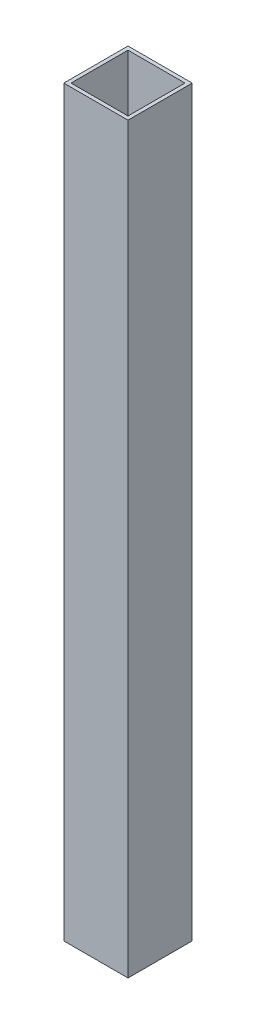
ISO-10303-21;
HEADER;
FILE_DESCRIPTION(('STEP AP214'),'2;1');
FILE_NAME('part.step','',(''),(''),'','','');
FILE_SCHEMA(('AUTOMOTIVE_DESIGN { 1 0 10303 214 1 1 1 1 }'));
ENDSEC;
DATA;
#1=APPLICATION_CONTEXT('core data for automotive mechanical design processes');
#2=APPLICATION_PROTOCOL_DEFINITION('international standard','automotive_design',2000,#1);
#3=PRODUCT_CONTEXT('',#1,'mechanical');
#4=PRODUCT('Part','Part','',(#3));
#5=PRODUCT_RELATED_PRODUCT_CATEGORY('part','',(#4));
#6=PRODUCT_DEFINITION_FORMATION('','',#4);
#7=PRODUCT_DEFINITION_CONTEXT('part definition',#1,'design');
#8=PRODUCT_DEFINITION('design','',#6,#7);
#9=PRODUCT_DEFINITION_SHAPE('','',#8);
#10=(LENGTH_UNIT() NAMED_UNIT(*) SI_UNIT(.MILLI.,.METRE.));
#11=(NAMED_UNIT(*) PLANE_ANGLE_UNIT() SI_UNIT($,.RADIAN.));
#12=(NAMED_UNIT(*) SI_UNIT($,.STERADIAN.) SOLID_ANGLE_UNIT());
#13=UNCERTAINTY_MEASURE_WITH_UNIT(LENGTH_MEASURE(1.E-05),#10,'distance_accuracy_value','');
#14=(GEOMETRIC_REPRESENTATION_CONTEXT(3) GLOBAL_UNCERTAINTY_ASSIGNED_CONTEXT((#13)) GLOBAL_UNIT_ASSIGNED_CONTEXT((#10,
#11,#12)) REPRESENTATION_CONTEXT('',''));
#15=CARTESIAN_POINT('',(0.,0.,0.));
#16=DIRECTION('',(0.,0.,1.));
#17=DIRECTION('',(1.,0.,0.));
#18=AXIS2_PLACEMENT_3D('',#15,#16,#17);
#19=CARTESIAN_POINT('',(28.575,-166.13125,28.575));
#20=DIRECTION('',(0.,-1.,0.));
#21=DIRECTION('',(0.,0.,-1.));
#22=AXIS2_PLACEMENT_3D('',#19,#20,#21);
#23=PLANE('',#22);
#24=DIRECTION('',(-1.,0.,0.));
#25=VECTOR('',#24,1.);
#26=CARTESIAN_POINT('',(28.575,-166.13125,0.));
#27=LINE('',#26,#25);
#28=CARTESIAN_POINT('',(28.575,-166.13125,0.));
#29=VERTEX_POINT('',#28);
#30=CARTESIAN_POINT('',(0.,-166.13125,0.));
#31=VERTEX_POINT('',#30);
#32=EDGE_CURVE('E116',#29,#31,#27,.T.);
#33=ORIENTED_EDGE('',*,*,#32,.F.);
#34=DIRECTION('',(0.,0.,-1.));
#35=VECTOR('',#34,1.);
#36=CARTESIAN_POINT('',(28.575,-166.13125,28.575));
#37=LINE('',#36,#35);
#38=CARTESIAN_POINT('',(28.575,-166.13125,28.575));
#39=VERTEX_POINT('',#38);
#40=EDGE_CURVE('E9',#39,#29,#37,.T.);
#41=ORIENTED_EDGE('',*,*,#40,.F.);
#42=DIRECTION('',(-1.,0.,0.));
#43=VECTOR('',#42,1.);
#44=CARTESIAN_POINT('',(28.575,-166.13125,28.575));
#45=LINE('',#44,#43);
#46=CARTESIAN_POINT('',(0.,-166.13125,28.575));
#47=VERTEX_POINT('',#46);
#48=EDGE_CURVE('E123',#39,#47,#45,.T.);
#49=ORIENTED_EDGE('',*,*,#48,.T.);
#50=DIRECTION('',(0.,0.,-1.));
#51=VECTOR('',#50,1.);
#52=CARTESIAN_POINT('',(0.,-166.13125,28.575));
#53=LINE('',#52,#51);
#54=EDGE_CURVE('E24',#47,#31,#53,.T.);
#55=ORIENTED_EDGE('',*,*,#54,.T.);
#56=EDGE_LOOP('',(#33,#41,#49,#55));
#57=FACE_BOUND('',#56,.T.);
#58=DIRECTION('',(0.,0.,-1.));
#59=VECTOR('',#58,1.);
#60=CARTESIAN_POINT('',(26.9748,-166.13125,28.575));
#61=LINE('',#60,#59);
#62=CARTESIAN_POINT('',(26.9748,-166.13125,26.9748));
#63=VERTEX_POINT('',#62);
#64=CARTESIAN_POINT('',(26.9748,-166.13125,1.6002));
#65=VERTEX_POINT('',#64);
#66=EDGE_CURVE('E107',#63,#65,#61,.T.);
#67=ORIENTED_EDGE('',*,*,#66,.T.);
#68=DIRECTION('',(-1.,0.,0.));
#69=VECTOR('',#68,1.);
#70=CARTESIAN_POINT('',(0.,-166.13125,1.6002));
#71=LINE('',#70,#69);
#72=CARTESIAN_POINT('',(1.6002,-166.13125,1.6002));
#73=VERTEX_POINT('',#72);
#74=EDGE_CURVE('E18',#65,#73,#71,.T.);
#75=ORIENTED_EDGE('',*,*,#74,.T.);
#76=DIRECTION('',(0.,0.,-1.));
#77=VECTOR('',#76,1.);
#78=CARTESIAN_POINT('',(1.6002,-166.13125,28.575));
#79=LINE('',#78,#77);
#80=CARTESIAN_POINT('',(1.6002,-166.13125,26.9748));
#81=VERTEX_POINT('',#80);
#82=EDGE_CURVE('E129',#81,#73,#79,.T.);
#83=ORIENTED_EDGE('',*,*,#82,.F.);
#84=DIRECTION('',(-1.,0.,0.));
#85=VECTOR('',#84,1.);
#86=CARTESIAN_POINT('',(0.,-166.13125,26.9748));
#87=LINE('',#86,#85);
#88=EDGE_CURVE('E109',#63,#81,#87,.T.);
#89=ORIENTED_EDGE('',*,*,#88,.F.);
#90=EDGE_LOOP('',(#67,#75,#83,#89));
#91=FACE_BOUND('',#90,.T.);
#92=ADVANCED_FACE('F15',(#57,#91),#23,.T.);
#93=CARTESIAN_POINT('',(-16.1601595564391,164.54375,28.575));
#94=DIRECTION('',(0.,-1.,0.));
#95=DIRECTION('',(0.,0.,-1.));
#96=AXIS2_PLACEMENT_3D('',#93,#94,#95);
#97=PLANE('',#96);
#98=DIRECTION('',(0.,0.,1.));
#99=VECTOR('',#98,1.);
#100=CARTESIAN_POINT('',(0.,164.54375,28.5749999999998));
#101=LINE('',#100,#99);
#102=CARTESIAN_POINT('',(0.,164.54375,0.));
#103=VERTEX_POINT('',#102);
#104=CARTESIAN_POINT('',(0.,164.54375,28.575));
#105=VERTEX_POINT('',#104);
#106=EDGE_CURVE('E144',#103,#105,#101,.T.);
#107=ORIENTED_EDGE('',*,*,#106,.T.);
#108=DIRECTION('',(1.,0.,0.));
#109=VECTOR('',#108,1.);
#110=CARTESIAN_POINT('',(-16.1601595564391,164.54375,28.575));
#111=LINE('',#110,#109);
#112=CARTESIAN_POINT('',(28.575,164.54375,28.575));
#113=VERTEX_POINT('',#112);
#114=EDGE_CURVE('E146',#105,#113,#111,.T.);
#115=ORIENTED_EDGE('',*,*,#114,.T.);
#116=DIRECTION('',(0.,0.,-1.));
#117=VECTOR('',#116,1.);
#118=CARTESIAN_POINT('',(28.575,164.54375,28.575));
#119=LINE('',#118,#117);
#120=CARTESIAN_POINT('',(28.575,164.54375,0.));
#121=VERTEX_POINT('',#120);
#122=EDGE_CURVE('E128',#113,#121,#119,.T.);
#123=ORIENTED_EDGE('',*,*,#122,.T.);
#124=DIRECTION('',(1.,0.,0.));
#125=VECTOR('',#124,1.);
#126=CARTESIAN_POINT('',(-16.1601595564391,164.54375,0.));
#127=LINE('',#126,#125);
#128=EDGE_CURVE('E86',#103,#121,#127,.T.);
#129=ORIENTED_EDGE('',*,*,#128,.F.);
#130=EDGE_LOOP('',(#107,#115,#123,#129));
#131=FACE_BOUND('',#130,.T.);
#132=DIRECTION('',(0.,0.,1.));
#133=VECTOR('',#132,1.);
#134=CARTESIAN_POINT('',(1.6002,164.54375,28.5749999999998));
#135=LINE('',#134,#133);
#136=CARTESIAN_POINT('',(1.6002,164.54375,1.6002));
#137=VERTEX_POINT('',#136);
#138=CARTESIAN_POINT('',(1.6002,164.54375,26.9748));
#139=VERTEX_POINT('',#138);
#140=EDGE_CURVE('E102',#137,#139,#135,.T.);
#141=ORIENTED_EDGE('',*,*,#140,.F.);
#142=DIRECTION('',(1.,0.,0.));
#143=VECTOR('',#142,1.);
#144=CARTESIAN_POINT('',(-16.1601595564391,164.54375,1.6002));
#145=LINE('',#144,#143);
#146=CARTESIAN_POINT('',(26.9748,164.54375,1.6002));
#147=VERTEX_POINT('',#146);
#148=EDGE_CURVE('E59',#137,#147,#145,.T.);
#149=ORIENTED_EDGE('',*,*,#148,.T.);
#150=DIRECTION('',(0.,0.,-1.));
#151=VECTOR('',#150,1.);
#152=CARTESIAN_POINT('',(26.9748,164.54375,28.575));
#153=LINE('',#152,#151);
#154=CARTESIAN_POINT('',(26.9748,164.54375,26.9748));
#155=VERTEX_POINT('',#154);
#156=EDGE_CURVE('E105',#155,#147,#153,.T.);
#157=ORIENTED_EDGE('',*,*,#156,.F.);
#158=DIRECTION('',(1.,0.,0.));
#159=VECTOR('',#158,1.);
#160=CARTESIAN_POINT('',(-16.1601595564391,164.54375,26.9748));
#161=LINE('',#160,#159);
#162=EDGE_CURVE('E95',#139,#155,#161,.T.);
#163=ORIENTED_EDGE('',*,*,#162,.F.);
#164=EDGE_LOOP('',(#141,#149,#157,#163));
#165=FACE_BOUND('',#164,.T.);
#166=ADVANCED_FACE('F111',(#131,#165),#97,.F.);
#167=CARTESIAN_POINT('',(28.575,159.54375,28.575));
#168=DIRECTION('',(1.,0.,0.));
#169=DIRECTION('',(0.,1.,0.));
#170=AXIS2_PLACEMENT_3D('',#167,#168,#169);
#171=PLANE('',#170);
#172=ORIENTED_EDGE('',*,*,#122,.F.);
#173=DIRECTION('',(0.,-1.,0.));
#174=VECTOR('',#173,1.);
#175=CARTESIAN_POINT('',(28.575,159.54375,28.575));
#176=LINE('',#175,#174);
#177=EDGE_CURVE('E125',#113,#39,#176,.T.);
#178=ORIENTED_EDGE('',*,*,#177,.T.);
#179=ORIENTED_EDGE('',*,*,#40,.T.);
#180=DIRECTION('',(0.,-1.,0.));
#181=VECTOR('',#180,1.);
#182=CARTESIAN_POINT('',(28.575,159.54375,0.));
#183=LINE('',#182,#181);
#184=EDGE_CURVE('E79',#121,#29,#183,.T.);
#185=ORIENTED_EDGE('',*,*,#184,.F.);
#186=EDGE_LOOP('',(#172,#178,#179,#185));
#187=FACE_BOUND('',#186,.T.);
#188=ADVANCED_FACE('F166',(#187),#171,.T.);
#189=CARTESIAN_POINT('',(0.,0.,28.575));
#190=DIRECTION('',(-1.,0.,0.));
#191=DIRECTION('',(0.,0.,1.));
#192=AXIS2_PLACEMENT_3D('',#189,#190,#191);
#193=PLANE('',#192);
#194=ORIENTED_EDGE('',*,*,#106,.F.);
#195=DIRECTION('',(0.,1.,0.));
#196=VECTOR('',#195,1.);
#197=CARTESIAN_POINT('',(0.,0.,0.));
#198=LINE('',#197,#196);
#199=EDGE_CURVE('E119',#31,#103,#198,.T.);
#200=ORIENTED_EDGE('',*,*,#199,.F.);
#201=ORIENTED_EDGE('',*,*,#54,.F.);
#202=DIRECTION('',(0.,1.,0.));
#203=VECTOR('',#202,1.);
#204=CARTESIAN_POINT('',(0.,0.,28.575));
#205=LINE('',#204,#203);
#206=EDGE_CURVE('E122',#47,#105,#205,.T.);
#207=ORIENTED_EDGE('',*,*,#206,.T.);
#208=EDGE_LOOP('',(#194,#200,#201,#207));
#209=FACE_BOUND('',#208,.T.);
#210=ADVANCED_FACE('F172',(#209),#193,.T.);
#211=CARTESIAN_POINT('',(0.,0.,28.575));
#212=DIRECTION('',(0.,0.,-1.));
#213=DIRECTION('',(-1.,0.,0.));
#214=AXIS2_PLACEMENT_3D('',#211,#212,#213);
#215=PLANE('',#214);
#216=ORIENTED_EDGE('',*,*,#177,.F.);
#217=ORIENTED_EDGE('',*,*,#114,.F.);
#218=ORIENTED_EDGE('',*,*,#206,.F.);
#219=ORIENTED_EDGE('',*,*,#48,.F.);
#220=EDGE_LOOP('',(#216,#217,#218,#219));
#221=FACE_BOUND('',#220,.T.);
#222=ADVANCED_FACE('F178',(#221),#215,.F.);
#223=CARTESIAN_POINT('',(0.,0.,0.));
#224=DIRECTION('',(0.,0.,-1.));
#225=DIRECTION('',(-1.,0.,0.));
#226=AXIS2_PLACEMENT_3D('',#223,#224,#225);
#227=PLANE('',#226);
#228=ORIENTED_EDGE('',*,*,#128,.T.);
#229=ORIENTED_EDGE('',*,*,#184,.T.);
#230=ORIENTED_EDGE('',*,*,#32,.T.);
#231=ORIENTED_EDGE('',*,*,#199,.T.);
#232=EDGE_LOOP('',(#228,#229,#230,#231));
#233=FACE_BOUND('',#232,.T.);
#234=ADVANCED_FACE('F170',(#233),#227,.T.);
#235=CARTESIAN_POINT('',(26.9748,159.54375,28.575));
#236=DIRECTION('',(1.,0.,0.));
#237=DIRECTION('',(0.,1.,0.));
#238=AXIS2_PLACEMENT_3D('',#235,#236,#237);
#239=PLANE('',#238);
#240=ORIENTED_EDGE('',*,*,#156,.T.);
#241=DIRECTION('',(0.,-1.,0.));
#242=VECTOR('',#241,1.);
#243=CARTESIAN_POINT('',(26.9748,0.,1.6002));
#244=LINE('',#243,#242);
#245=EDGE_CURVE('E55',#147,#65,#244,.T.);
#246=ORIENTED_EDGE('',*,*,#245,.T.);
#247=ORIENTED_EDGE('',*,*,#66,.F.);
#248=DIRECTION('',(0.,-1.,0.));
#249=VECTOR('',#248,1.);
#250=CARTESIAN_POINT('',(26.9748,0.,26.9748));
#251=LINE('',#250,#249);
#252=EDGE_CURVE('E98',#155,#63,#251,.T.);
#253=ORIENTED_EDGE('',*,*,#252,.F.);
#254=EDGE_LOOP('',(#240,#246,#247,#253));
#255=FACE_BOUND('',#254,.T.);
#256=ADVANCED_FACE('F104',(#255),#239,.F.);
#257=CARTESIAN_POINT('',(1.6002,0.,28.575));
#258=DIRECTION('',(-1.,0.,0.));
#259=DIRECTION('',(0.,0.,1.));
#260=AXIS2_PLACEMENT_3D('',#257,#258,#259);
#261=PLANE('',#260);
#262=ORIENTED_EDGE('',*,*,#140,.T.);
#263=DIRECTION('',(0.,1.,0.));
#264=VECTOR('',#263,1.);
#265=CARTESIAN_POINT('',(1.6002,0.,26.9748));
#266=LINE('',#265,#264);
#267=EDGE_CURVE('E33',#81,#139,#266,.T.);
#268=ORIENTED_EDGE('',*,*,#267,.F.);
#269=ORIENTED_EDGE('',*,*,#82,.T.);
#270=DIRECTION('',(0.,1.,0.));
#271=VECTOR('',#270,1.);
#272=CARTESIAN_POINT('',(1.6002,0.,1.6002));
#273=LINE('',#272,#271);
#274=EDGE_CURVE('E47',#73,#137,#273,.T.);
#275=ORIENTED_EDGE('',*,*,#274,.T.);
#276=EDGE_LOOP('',(#262,#268,#269,#275));
#277=FACE_BOUND('',#276,.T.);
#278=ADVANCED_FACE('F158',(#277),#261,.F.);
#279=CARTESIAN_POINT('',(0.,0.,26.9748));
#280=DIRECTION('',(0.,0.,-1.));
#281=DIRECTION('',(-1.,0.,0.));
#282=AXIS2_PLACEMENT_3D('',#279,#280,#281);
#283=PLANE('',#282);
#284=ORIENTED_EDGE('',*,*,#252,.T.);
#285=ORIENTED_EDGE('',*,*,#88,.T.);
#286=ORIENTED_EDGE('',*,*,#267,.T.);
#287=ORIENTED_EDGE('',*,*,#162,.T.);
#288=EDGE_LOOP('',(#284,#285,#286,#287));
#289=FACE_BOUND('',#288,.T.);
#290=ADVANCED_FACE('F97',(#289),#283,.T.);
#291=CARTESIAN_POINT('',(0.,0.,1.6002));
#292=DIRECTION('',(0.,0.,-1.));
#293=DIRECTION('',(-1.,0.,0.));
#294=AXIS2_PLACEMENT_3D('',#291,#292,#293);
#295=PLANE('',#294);
#296=ORIENTED_EDGE('',*,*,#148,.F.);
#297=ORIENTED_EDGE('',*,*,#274,.F.);
#298=ORIENTED_EDGE('',*,*,#74,.F.);
#299=ORIENTED_EDGE('',*,*,#245,.F.);
#300=EDGE_LOOP('',(#296,#297,#298,#299));
#301=FACE_BOUND('',#300,.T.);
#302=ADVANCED_FACE('F151',(#301),#295,.F.);
#303=CLOSED_SHELL('',(#92,#166,#188,#210,#222,#234,#256,#278,#290,#302));
#304=MANIFOLD_SOLID_BREP('B1',#303);
#305=ADVANCED_BREP_SHAPE_REPRESENTATION('',(#18,#304),#14);
#306=SHAPE_DEFINITION_REPRESENTATION(#9,#305);
ENDSEC;
END-ISO-10303-21;
